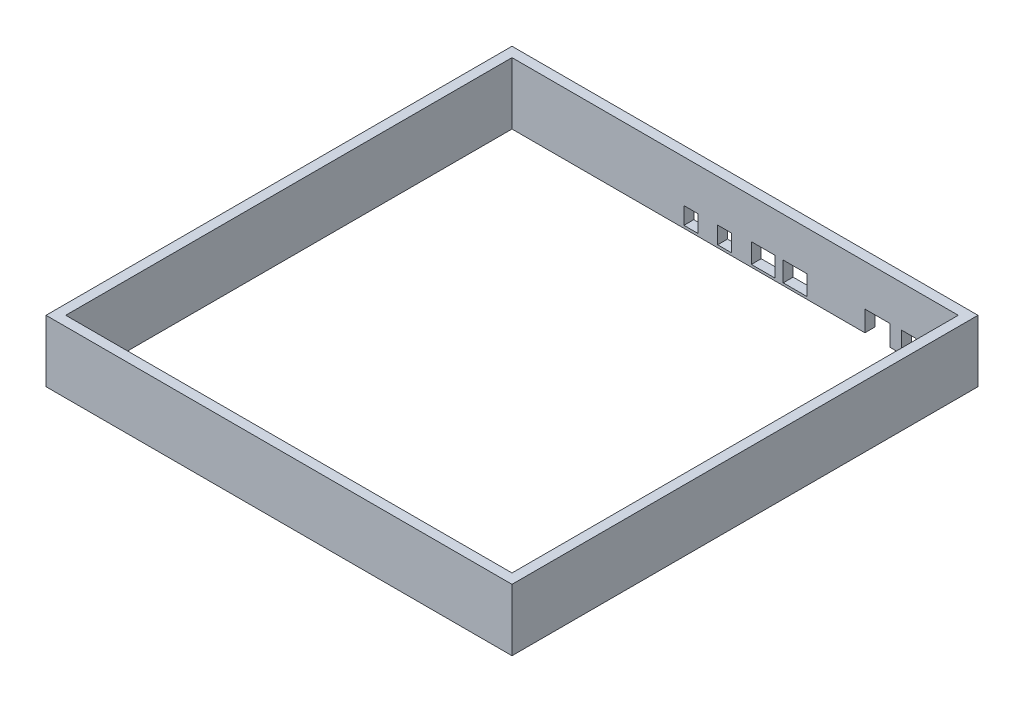
ISO-10303-21;
HEADER;
FILE_DESCRIPTION(('STEP AP214'),'2;1');
FILE_NAME('part.step','',(''),(''),'','','');
FILE_SCHEMA(('AUTOMOTIVE_DESIGN { 1 0 10303 214 1 1 1 1 }'));
ENDSEC;
DATA;
#1=APPLICATION_CONTEXT('core data for automotive mechanical design processes');
#2=APPLICATION_PROTOCOL_DEFINITION('international standard','automotive_design',2000,#1);
#3=PRODUCT_CONTEXT('',#1,'mechanical');
#4=PRODUCT('Part','Part','',(#3));
#5=PRODUCT_RELATED_PRODUCT_CATEGORY('part','',(#4));
#6=PRODUCT_DEFINITION_FORMATION('','',#4);
#7=PRODUCT_DEFINITION_CONTEXT('part definition',#1,'design');
#8=PRODUCT_DEFINITION('design','',#6,#7);
#9=PRODUCT_DEFINITION_SHAPE('','',#8);
#10=(LENGTH_UNIT() NAMED_UNIT(*) SI_UNIT(.MILLI.,.METRE.));
#11=(NAMED_UNIT(*) PLANE_ANGLE_UNIT() SI_UNIT($,.RADIAN.));
#12=(NAMED_UNIT(*) SI_UNIT($,.STERADIAN.) SOLID_ANGLE_UNIT());
#13=UNCERTAINTY_MEASURE_WITH_UNIT(LENGTH_MEASURE(1.E-05),#10,'distance_accuracy_value','');
#14=(GEOMETRIC_REPRESENTATION_CONTEXT(3) GLOBAL_UNCERTAINTY_ASSIGNED_CONTEXT((#13)) GLOBAL_UNIT_ASSIGNED_CONTEXT((#10,
#11,#12)) REPRESENTATION_CONTEXT('',''));
#15=CARTESIAN_POINT('',(0.,0.,0.));
#16=DIRECTION('',(0.,0.,1.));
#17=DIRECTION('',(1.,0.,0.));
#18=AXIS2_PLACEMENT_3D('',#15,#16,#17);
#19=CARTESIAN_POINT('',(0.,0.,0.));
#20=DIRECTION('',(0.,-1.,0.));
#21=DIRECTION('',(0.,0.,-1.));
#22=AXIS2_PLACEMENT_3D('',#19,#20,#21);
#23=PLANE('',#22);
#24=DIRECTION('',(-1.,0.,0.));
#25=VECTOR('',#24,1.);
#26=CARTESIAN_POINT('',(-150.,0.,-150.));
#27=LINE('',#26,#25);
#28=CARTESIAN_POINT('',(83.5466241257266,0.,-150.));
#29=VERTEX_POINT('',#28);
#30=CARTESIAN_POINT('',(-150.,0.,-150.));
#31=VERTEX_POINT('',#30);
#32=EDGE_CURVE('E564',#29,#31,#27,.T.);
#33=ORIENTED_EDGE('',*,*,#32,.F.);
#34=DIRECTION('',(0.,0.,-1.));
#35=VECTOR('',#34,1.);
#36=CARTESIAN_POINT('',(83.5466241257266,0.,150.001));
#37=LINE('',#36,#35);
#38=CARTESIAN_POINT('',(83.5466241257266,0.,-143.65));
#39=VERTEX_POINT('',#38);
#40=EDGE_CURVE('E302',#39,#29,#37,.T.);
#41=ORIENTED_EDGE('',*,*,#40,.F.);
#42=DIRECTION('',(-1.,0.,0.));
#43=VECTOR('',#42,1.);
#44=CARTESIAN_POINT('',(-143.65,0.,-143.65));
#45=LINE('',#44,#43);
#46=CARTESIAN_POINT('',(-143.65,0.,-143.65));
#47=VERTEX_POINT('',#46);
#48=EDGE_CURVE('E526',#39,#47,#45,.T.);
#49=ORIENTED_EDGE('',*,*,#48,.T.);
#50=DIRECTION('',(0.,0.,1.));
#51=VECTOR('',#50,1.);
#52=CARTESIAN_POINT('',(-143.65,0.,143.65));
#53=LINE('',#52,#51);
#54=CARTESIAN_POINT('',(-143.65,0.,143.65));
#55=VERTEX_POINT('',#54);
#56=EDGE_CURVE('E530',#47,#55,#53,.T.);
#57=ORIENTED_EDGE('',*,*,#56,.T.);
#58=DIRECTION('',(1.,0.,0.));
#59=VECTOR('',#58,1.);
#60=CARTESIAN_POINT('',(-143.65,0.,143.65));
#61=LINE('',#60,#59);
#62=CARTESIAN_POINT('',(143.65,0.,143.65));
#63=VERTEX_POINT('',#62);
#64=EDGE_CURVE('E513',#55,#63,#61,.T.);
#65=ORIENTED_EDGE('',*,*,#64,.T.);
#66=DIRECTION('',(0.,0.,-1.));
#67=VECTOR('',#66,1.);
#68=CARTESIAN_POINT('',(143.65,0.,143.65));
#69=LINE('',#68,#67);
#70=CARTESIAN_POINT('',(143.65,0.,-143.65));
#71=VERTEX_POINT('',#70);
#72=EDGE_CURVE('E509',#63,#71,#69,.T.);
#73=ORIENTED_EDGE('',*,*,#72,.T.);
#74=CARTESIAN_POINT('',(99.5486241257266,0.,-143.65));
#75=VERTEX_POINT('',#74);
#76=EDGE_CURVE('E527',#71,#75,#45,.T.);
#77=ORIENTED_EDGE('',*,*,#76,.T.);
#78=DIRECTION('',(0.,0.,-1.));
#79=VECTOR('',#78,1.);
#80=CARTESIAN_POINT('',(99.5486241257266,0.,150.001));
#81=LINE('',#80,#79);
#82=CARTESIAN_POINT('',(99.5486241257266,0.,-150.));
#83=VERTEX_POINT('',#82);
#84=EDGE_CURVE('E412',#75,#83,#81,.T.);
#85=ORIENTED_EDGE('',*,*,#84,.T.);
#86=CARTESIAN_POINT('',(150.,0.,-150.));
#87=VERTEX_POINT('',#86);
#88=EDGE_CURVE('E565',#87,#83,#27,.T.);
#89=ORIENTED_EDGE('',*,*,#88,.F.);
#90=DIRECTION('',(0.,0.,-1.));
#91=VECTOR('',#90,1.);
#92=CARTESIAN_POINT('',(150.,0.,150.));
#93=LINE('',#92,#91);
#94=CARTESIAN_POINT('',(150.,0.,150.));
#95=VERTEX_POINT('',#94);
#96=EDGE_CURVE('E547',#95,#87,#93,.T.);
#97=ORIENTED_EDGE('',*,*,#96,.F.);
#98=DIRECTION('',(1.,0.,0.));
#99=VECTOR('',#98,1.);
#100=CARTESIAN_POINT('',(-150.,0.,150.));
#101=LINE('',#100,#99);
#102=CARTESIAN_POINT('',(-150.,0.,150.));
#103=VERTEX_POINT('',#102);
#104=EDGE_CURVE('E552',#103,#95,#101,.T.);
#105=ORIENTED_EDGE('',*,*,#104,.F.);
#106=DIRECTION('',(0.,0.,1.));
#107=VECTOR('',#106,1.);
#108=CARTESIAN_POINT('',(-150.,0.,150.));
#109=LINE('',#108,#107);
#110=EDGE_CURVE('E568',#31,#103,#109,.T.);
#111=ORIENTED_EDGE('',*,*,#110,.F.);
#112=EDGE_LOOP('',(#33,#41,#49,#57,#65,#73,#77,#85,#89,#97,#105,#111));
#113=FACE_BOUND('',#112,.T.);
#114=ADVANCED_FACE('F38',(#113),#23,.T.);
#115=CARTESIAN_POINT('',(-150.,39.8272,-150.));
#116=DIRECTION('',(0.,0.,1.));
#117=DIRECTION('',(1.,0.,0.));
#118=AXIS2_PLACEMENT_3D('',#115,#116,#117);
#119=PLANE('',#118);
#120=DIRECTION('',(0.,-1.,0.));
#121=VECTOR('',#120,1.);
#122=CARTESIAN_POINT('',(-32.9574289216493,12.6748,-150.));
#123=LINE('',#122,#121);
#124=CARTESIAN_POINT('',(-32.9574289216493,12.6748,-150.));
#125=VERTEX_POINT('',#124);
#126=CARTESIAN_POINT('',(-32.9574289216493,1.67480000000004,-150.));
#127=VERTEX_POINT('',#126);
#128=EDGE_CURVE('E450',#125,#127,#123,.T.);
#129=ORIENTED_EDGE('',*,*,#128,.T.);
#130=DIRECTION('',(-1.,0.,0.));
#131=VECTOR('',#130,1.);
#132=CARTESIAN_POINT('',(-23.9574289216493,1.67480000000004,-150.));
#133=LINE('',#132,#131);
#134=CARTESIAN_POINT('',(-23.9574289216493,1.67480000000004,-150.));
#135=VERTEX_POINT('',#134);
#136=EDGE_CURVE('E55',#135,#127,#133,.T.);
#137=ORIENTED_EDGE('',*,*,#136,.F.);
#138=DIRECTION('',(0.,-1.,0.));
#139=VECTOR('',#138,1.);
#140=CARTESIAN_POINT('',(-23.9574289216493,12.6748,-150.));
#141=LINE('',#140,#139);
#142=CARTESIAN_POINT('',(-23.9574289216493,12.6748,-150.));
#143=VERTEX_POINT('',#142);
#144=EDGE_CURVE('E435',#143,#135,#141,.T.);
#145=ORIENTED_EDGE('',*,*,#144,.F.);
#146=DIRECTION('',(-1.,0.,0.));
#147=VECTOR('',#146,1.);
#148=CARTESIAN_POINT('',(-23.9574289216493,12.6748,-150.));
#149=LINE('',#148,#147);
#150=EDGE_CURVE('E446',#143,#125,#149,.T.);
#151=ORIENTED_EDGE('',*,*,#150,.T.);
#152=EDGE_LOOP('',(#129,#137,#145,#151));
#153=FACE_BOUND('',#152,.T.);
#154=DIRECTION('',(0.,-1.,0.));
#155=VECTOR('',#154,1.);
#156=CARTESIAN_POINT('',(83.5466241257266,0.,-150.));
#157=LINE('',#156,#155);
#158=CARTESIAN_POINT('',(83.5466241257266,13.258800000001,-150.));
#159=VERTEX_POINT('',#158);
#160=EDGE_CURVE('E420',#159,#29,#157,.T.);
#161=ORIENTED_EDGE('',*,*,#160,.T.);
#162=ORIENTED_EDGE('',*,*,#32,.T.);
#163=DIRECTION('',(0.,-1.,0.));
#164=VECTOR('',#163,1.);
#165=CARTESIAN_POINT('',(-150.,39.8272,-150.));
#166=LINE('',#165,#164);
#167=CARTESIAN_POINT('',(-150.,39.8272,-150.));
#168=VERTEX_POINT('',#167);
#169=EDGE_CURVE('E46',#168,#31,#166,.T.);
#170=ORIENTED_EDGE('',*,*,#169,.F.);
#171=DIRECTION('',(-1.,0.,0.));
#172=VECTOR('',#171,1.);
#173=CARTESIAN_POINT('',(-150.,39.8272,-150.));
#174=LINE('',#173,#172);
#175=CARTESIAN_POINT('',(150.,39.8272,-150.));
#176=VERTEX_POINT('',#175);
#177=EDGE_CURVE('E551',#176,#168,#174,.T.);
#178=ORIENTED_EDGE('',*,*,#177,.F.);
#179=DIRECTION('',(0.,-1.,0.));
#180=VECTOR('',#179,1.);
#181=CARTESIAN_POINT('',(150.,39.8272,-150.));
#182=LINE('',#181,#180);
#183=EDGE_CURVE('E11',#176,#87,#182,.T.);
#184=ORIENTED_EDGE('',*,*,#183,.T.);
#185=ORIENTED_EDGE('',*,*,#88,.T.);
#186=DIRECTION('',(0.,-1.,0.));
#187=VECTOR('',#186,1.);
#188=CARTESIAN_POINT('',(99.5486241257266,0.,-150.));
#189=LINE('',#188,#187);
#190=CARTESIAN_POINT('',(99.5486241257266,13.258800000001,-150.));
#191=VERTEX_POINT('',#190);
#192=EDGE_CURVE('E409',#191,#83,#189,.T.);
#193=ORIENTED_EDGE('',*,*,#192,.F.);
#194=DIRECTION('',(-1.,0.,0.));
#195=VECTOR('',#194,1.);
#196=CARTESIAN_POINT('',(0.,13.258800000001,-150.));
#197=LINE('',#196,#195);
#198=EDGE_CURVE('E417',#191,#159,#197,.T.);
#199=ORIENTED_EDGE('',*,*,#198,.T.);
#200=EDGE_LOOP('',(#161,#162,#170,#178,#184,#185,#193,#199));
#201=FACE_BOUND('',#200,.T.);
#202=DIRECTION('',(0.,1.,0.));
#203=VECTOR('',#202,1.);
#204=CARTESIAN_POINT('',(107.152019667205,0.,-150.));
#205=LINE('',#204,#203);
#206=CARTESIAN_POINT('',(107.152019667205,2.24078925769597,-150.));
#207=VERTEX_POINT('',#206);
#208=CARTESIAN_POINT('',(107.152019667205,13.305953258215,-150.));
#209=VERTEX_POINT('',#208);
#210=EDGE_CURVE('E308',#207,#209,#205,.T.);
#211=ORIENTED_EDGE('',*,*,#210,.F.);
#212=DIRECTION('',(-1.,0.,0.));
#213=VECTOR('',#212,1.);
#214=CARTESIAN_POINT('',(0.,2.24078925769597,-150.));
#215=LINE('',#214,#213);
#216=CARTESIAN_POINT('',(116.566624125727,2.24078925769597,-150.));
#217=VERTEX_POINT('',#216);
#218=EDGE_CURVE('E292',#217,#207,#215,.T.);
#219=ORIENTED_EDGE('',*,*,#218,.F.);
#220=DIRECTION('',(0.,1.,0.));
#221=VECTOR('',#220,1.);
#222=CARTESIAN_POINT('',(116.566624125727,0.,-150.));
#223=LINE('',#222,#221);
#224=CARTESIAN_POINT('',(116.566624125727,13.305953258215,-150.));
#225=VERTEX_POINT('',#224);
#226=EDGE_CURVE('E313',#217,#225,#223,.T.);
#227=ORIENTED_EDGE('',*,*,#226,.T.);
#228=DIRECTION('',(-1.,0.,0.));
#229=VECTOR('',#228,1.);
#230=CARTESIAN_POINT('',(0.,13.305953258215,-150.));
#231=LINE('',#230,#229);
#232=EDGE_CURVE('E285',#225,#209,#231,.T.);
#233=ORIENTED_EDGE('',*,*,#232,.T.);
#234=EDGE_LOOP('',(#211,#219,#227,#233));
#235=FACE_BOUND('',#234,.T.);
#236=DIRECTION('',(0.,-1.,0.));
#237=VECTOR('',#236,1.);
#238=CARTESIAN_POINT('',(10.4425710783508,0.,-150.));
#239=LINE('',#238,#237);
#240=CARTESIAN_POINT('',(10.4425710783508,14.2748,-150.));
#241=VERTEX_POINT('',#240);
#242=CARTESIAN_POINT('',(10.4425710783508,1.5748,-150.));
#243=VERTEX_POINT('',#242);
#244=EDGE_CURVE('E477',#241,#243,#239,.T.);
#245=ORIENTED_EDGE('',*,*,#244,.T.);
#246=DIRECTION('',(-1.,0.,0.));
#247=VECTOR('',#246,1.);
#248=CARTESIAN_POINT('',(0.,1.5748,-150.));
#249=LINE('',#248,#247);
#250=CARTESIAN_POINT('',(25.7425710783508,1.5748,-150.));
#251=VERTEX_POINT('',#250);
#252=EDGE_CURVE('E489',#251,#243,#249,.T.);
#253=ORIENTED_EDGE('',*,*,#252,.F.);
#254=DIRECTION('',(0.,-1.,0.));
#255=VECTOR('',#254,1.);
#256=CARTESIAN_POINT('',(25.7425710783508,0.,-150.));
#257=LINE('',#256,#255);
#258=CARTESIAN_POINT('',(25.7425710783508,14.2748,-150.));
#259=VERTEX_POINT('',#258);
#260=EDGE_CURVE('E485',#259,#251,#257,.T.);
#261=ORIENTED_EDGE('',*,*,#260,.F.);
#262=DIRECTION('',(-1.,0.,0.));
#263=VECTOR('',#262,1.);
#264=CARTESIAN_POINT('',(0.,14.2748,-150.));
#265=LINE('',#264,#263);
#266=EDGE_CURVE('E481',#259,#241,#265,.T.);
#267=ORIENTED_EDGE('',*,*,#266,.T.);
#268=EDGE_LOOP('',(#245,#253,#261,#267));
#269=FACE_BOUND('',#268,.T.);
#270=DIRECTION('',(-1.,0.,0.));
#271=VECTOR('',#270,1.);
#272=CARTESIAN_POINT('',(-2.25742892164925,12.6748,-150.));
#273=LINE('',#272,#271);
#274=CARTESIAN_POINT('',(-2.25742892164926,12.6748,-150.));
#275=VERTEX_POINT('',#274);
#276=CARTESIAN_POINT('',(-11.2574289216493,12.6748,-150.));
#277=VERTEX_POINT('',#276);
#278=EDGE_CURVE('E346',#275,#277,#273,.T.);
#279=ORIENTED_EDGE('',*,*,#278,.T.);
#280=DIRECTION('',(0.,1.,0.));
#281=VECTOR('',#280,1.);
#282=CARTESIAN_POINT('',(-11.2574289216493,1.67480000000004,-150.));
#283=LINE('',#282,#281);
#284=CARTESIAN_POINT('',(-11.2574289216493,1.67480000000004,-150.));
#285=VERTEX_POINT('',#284);
#286=EDGE_CURVE('E342',#285,#277,#283,.T.);
#287=ORIENTED_EDGE('',*,*,#286,.F.);
#288=DIRECTION('',(-1.,0.,0.));
#289=VECTOR('',#288,1.);
#290=CARTESIAN_POINT('',(-2.25742892164925,1.67480000000004,-150.));
#291=LINE('',#290,#289);
#292=CARTESIAN_POINT('',(-2.25742892164925,1.67480000000004,-150.));
#293=VERTEX_POINT('',#292);
#294=EDGE_CURVE('E338',#293,#285,#291,.T.);
#295=ORIENTED_EDGE('',*,*,#294,.F.);
#296=DIRECTION('',(0.,1.,0.));
#297=VECTOR('',#296,1.);
#298=CARTESIAN_POINT('',(-2.25742892164925,1.67480000000004,-150.));
#299=LINE('',#298,#297);
#300=EDGE_CURVE('E334',#293,#275,#299,.T.);
#301=ORIENTED_EDGE('',*,*,#300,.T.);
#302=EDGE_LOOP('',(#279,#287,#295,#301));
#303=FACE_BOUND('',#302,.T.);
#304=DIRECTION('',(0.,-1.,0.));
#305=VECTOR('',#304,1.);
#306=CARTESIAN_POINT('',(30.9684484780568,0.,-150.));
#307=LINE('',#306,#305);
#308=CARTESIAN_POINT('',(30.9684484780568,14.2748,-150.));
#309=VERTEX_POINT('',#308);
#310=CARTESIAN_POINT('',(30.9684484780568,1.5748,-150.));
#311=VERTEX_POINT('',#310);
#312=EDGE_CURVE('E66',#309,#311,#307,.T.);
#313=ORIENTED_EDGE('',*,*,#312,.T.);
#314=DIRECTION('',(-1.,0.,0.));
#315=VECTOR('',#314,1.);
#316=CARTESIAN_POINT('',(0.,1.5748,-150.));
#317=LINE('',#316,#315);
#318=CARTESIAN_POINT('',(46.2684484780568,1.5748,-150.));
#319=VERTEX_POINT('',#318);
#320=EDGE_CURVE('E372',#319,#311,#317,.T.);
#321=ORIENTED_EDGE('',*,*,#320,.F.);
#322=DIRECTION('',(0.,-1.,0.));
#323=VECTOR('',#322,1.);
#324=CARTESIAN_POINT('',(46.2684484780568,0.,-150.));
#325=LINE('',#324,#323);
#326=CARTESIAN_POINT('',(46.2684484780568,14.2748,-150.));
#327=VERTEX_POINT('',#326);
#328=EDGE_CURVE('E384',#327,#319,#325,.T.);
#329=ORIENTED_EDGE('',*,*,#328,.F.);
#330=DIRECTION('',(-1.,0.,0.));
#331=VECTOR('',#330,1.);
#332=CARTESIAN_POINT('',(0.,14.2748,-150.));
#333=LINE('',#332,#331);
#334=EDGE_CURVE('E388',#327,#309,#333,.T.);
#335=ORIENTED_EDGE('',*,*,#334,.T.);
#336=EDGE_LOOP('',(#313,#321,#329,#335));
#337=FACE_BOUND('',#336,.T.);
#338=ADVANCED_FACE('F600',(#153,#201,#235,#269,#303,#337),#119,.F.);
#339=CARTESIAN_POINT('',(-143.65,39.8272,-143.65));
#340=DIRECTION('',(0.,0.,1.));
#341=DIRECTION('',(1.,0.,0.));
#342=AXIS2_PLACEMENT_3D('',#339,#340,#341);
#343=PLANE('',#342);
#344=DIRECTION('',(-1.,0.,0.));
#345=VECTOR('',#344,1.);
#346=CARTESIAN_POINT('',(-23.9574289216493,1.67480000000004,-143.65));
#347=LINE('',#346,#345);
#348=CARTESIAN_POINT('',(-23.9574289216493,1.67480000000004,-143.65));
#349=VERTEX_POINT('',#348);
#350=CARTESIAN_POINT('',(-32.9574289216493,1.67480000000004,-143.65));
#351=VERTEX_POINT('',#350);
#352=EDGE_CURVE('E456',#349,#351,#347,.T.);
#353=ORIENTED_EDGE('',*,*,#352,.T.);
#354=DIRECTION('',(0.,-1.,0.));
#355=VECTOR('',#354,1.);
#356=CARTESIAN_POINT('',(-32.9574289216493,12.6748,-143.65));
#357=LINE('',#356,#355);
#358=CARTESIAN_POINT('',(-32.9574289216493,12.6748,-143.65));
#359=VERTEX_POINT('',#358);
#360=EDGE_CURVE('E427',#359,#351,#357,.T.);
#361=ORIENTED_EDGE('',*,*,#360,.F.);
#362=DIRECTION('',(-1.,0.,0.));
#363=VECTOR('',#362,1.);
#364=CARTESIAN_POINT('',(-23.9574289216493,12.6748,-143.65));
#365=LINE('',#364,#363);
#366=CARTESIAN_POINT('',(-23.9574289216493,12.6748,-143.65));
#367=VERTEX_POINT('',#366);
#368=EDGE_CURVE('E321',#367,#359,#365,.T.);
#369=ORIENTED_EDGE('',*,*,#368,.F.);
#370=DIRECTION('',(0.,-1.,0.));
#371=VECTOR('',#370,1.);
#372=CARTESIAN_POINT('',(-23.9574289216493,12.6748,-143.65));
#373=LINE('',#372,#371);
#374=EDGE_CURVE('E460',#367,#349,#373,.T.);
#375=ORIENTED_EDGE('',*,*,#374,.T.);
#376=EDGE_LOOP('',(#353,#361,#369,#375));
#377=FACE_BOUND('',#376,.T.);
#378=DIRECTION('',(-1.,0.,0.));
#379=VECTOR('',#378,1.);
#380=CARTESIAN_POINT('',(0.,2.24078925769597,-143.65));
#381=LINE('',#380,#379);
#382=CARTESIAN_POINT('',(116.566624125727,2.24078925769597,-143.65));
#383=VERTEX_POINT('',#382);
#384=CARTESIAN_POINT('',(107.152019667205,2.24078925769597,-143.65));
#385=VERTEX_POINT('',#384);
#386=EDGE_CURVE('E289',#383,#385,#381,.T.);
#387=ORIENTED_EDGE('',*,*,#386,.T.);
#388=DIRECTION('',(0.,1.,0.));
#389=VECTOR('',#388,1.);
#390=CARTESIAN_POINT('',(107.152019667205,0.,-143.65));
#391=LINE('',#390,#389);
#392=CARTESIAN_POINT('',(107.152019667205,13.305953258215,-143.65));
#393=VERTEX_POINT('',#392);
#394=EDGE_CURVE('E274',#385,#393,#391,.T.);
#395=ORIENTED_EDGE('',*,*,#394,.T.);
#396=DIRECTION('',(-1.,0.,0.));
#397=VECTOR('',#396,1.);
#398=CARTESIAN_POINT('',(0.,13.305953258215,-143.65));
#399=LINE('',#398,#397);
#400=CARTESIAN_POINT('',(116.566624125727,13.305953258215,-143.65));
#401=VERTEX_POINT('',#400);
#402=EDGE_CURVE('E362',#401,#393,#399,.T.);
#403=ORIENTED_EDGE('',*,*,#402,.F.);
#404=DIRECTION('',(0.,1.,0.));
#405=VECTOR('',#404,1.);
#406=CARTESIAN_POINT('',(116.566624125727,0.,-143.65));
#407=LINE('',#406,#405);
#408=EDGE_CURVE('E298',#383,#401,#407,.T.);
#409=ORIENTED_EDGE('',*,*,#408,.F.);
#410=EDGE_LOOP('',(#387,#395,#403,#409));
#411=FACE_BOUND('',#410,.T.);
#412=DIRECTION('',(-1.,0.,0.));
#413=VECTOR('',#412,1.);
#414=CARTESIAN_POINT('',(0.,1.5748,-143.65));
#415=LINE('',#414,#413);
#416=CARTESIAN_POINT('',(25.7425710783508,1.5748,-143.65));
#417=VERTEX_POINT('',#416);
#418=CARTESIAN_POINT('',(10.4425710783508,1.5748,-143.65));
#419=VERTEX_POINT('',#418);
#420=EDGE_CURVE('E469',#417,#419,#415,.T.);
#421=ORIENTED_EDGE('',*,*,#420,.T.);
#422=DIRECTION('',(0.,-1.,0.));
#423=VECTOR('',#422,1.);
#424=CARTESIAN_POINT('',(10.4425710783508,0.,-143.65));
#425=LINE('',#424,#423);
#426=CARTESIAN_POINT('',(10.4425710783508,14.2748,-143.65));
#427=VERTEX_POINT('',#426);
#428=EDGE_CURVE('E473',#427,#419,#425,.T.);
#429=ORIENTED_EDGE('',*,*,#428,.F.);
#430=DIRECTION('',(-1.,0.,0.));
#431=VECTOR('',#430,1.);
#432=CARTESIAN_POINT('',(0.,14.2748,-143.65));
#433=LINE('',#432,#431);
#434=CARTESIAN_POINT('',(25.7425710783508,14.2748,-143.65));
#435=VERTEX_POINT('',#434);
#436=EDGE_CURVE('E497',#435,#427,#433,.T.);
#437=ORIENTED_EDGE('',*,*,#436,.F.);
#438=DIRECTION('',(0.,-1.,0.));
#439=VECTOR('',#438,1.);
#440=CARTESIAN_POINT('',(25.7425710783508,0.,-143.65));
#441=LINE('',#440,#439);
#442=EDGE_CURVE('E405',#435,#417,#441,.T.);
#443=ORIENTED_EDGE('',*,*,#442,.T.);
#444=EDGE_LOOP('',(#421,#429,#437,#443));
#445=FACE_BOUND('',#444,.T.);
#446=DIRECTION('',(0.,1.,0.));
#447=VECTOR('',#446,1.);
#448=CARTESIAN_POINT('',(-11.2574289216493,1.67480000000004,-143.65));
#449=LINE('',#448,#447);
#450=CARTESIAN_POINT('',(-11.2574289216493,1.67480000000004,-143.65));
#451=VERTEX_POINT('',#450);
#452=CARTESIAN_POINT('',(-11.2574289216493,12.6748,-143.65));
#453=VERTEX_POINT('',#452);
#454=EDGE_CURVE('E354',#451,#453,#449,.T.);
#455=ORIENTED_EDGE('',*,*,#454,.T.);
#456=DIRECTION('',(-1.,0.,0.));
#457=VECTOR('',#456,1.);
#458=CARTESIAN_POINT('',(-2.25742892164925,12.6748,-143.65));
#459=LINE('',#458,#457);
#460=CARTESIAN_POINT('',(-2.25742892164925,12.6748,-143.65));
#461=VERTEX_POINT('',#460);
#462=EDGE_CURVE('E350',#461,#453,#459,.T.);
#463=ORIENTED_EDGE('',*,*,#462,.F.);
#464=DIRECTION('',(0.,1.,0.));
#465=VECTOR('',#464,1.);
#466=CARTESIAN_POINT('',(-2.25742892164925,1.67480000000004,-143.65));
#467=LINE('',#466,#465);
#468=CARTESIAN_POINT('',(-2.25742892164926,1.67480000000004,-143.65));
#469=VERTEX_POINT('',#468);
#470=EDGE_CURVE('E316',#469,#461,#467,.T.);
#471=ORIENTED_EDGE('',*,*,#470,.F.);
#472=DIRECTION('',(-1.,0.,0.));
#473=VECTOR('',#472,1.);
#474=CARTESIAN_POINT('',(-2.25742892164925,1.67480000000004,-143.65));
#475=LINE('',#474,#473);
#476=EDGE_CURVE('E358',#469,#451,#475,.T.);
#477=ORIENTED_EDGE('',*,*,#476,.T.);
#478=EDGE_LOOP('',(#455,#463,#471,#477));
#479=FACE_BOUND('',#478,.T.);
#480=ORIENTED_EDGE('',*,*,#48,.F.);
#481=DIRECTION('',(0.,-1.,0.));
#482=VECTOR('',#481,1.);
#483=CARTESIAN_POINT('',(83.5466241257266,0.,-143.65));
#484=LINE('',#483,#482);
#485=CARTESIAN_POINT('',(83.5466241257266,13.258800000001,-143.65));
#486=VERTEX_POINT('',#485);
#487=EDGE_CURVE('E423',#486,#39,#484,.T.);
#488=ORIENTED_EDGE('',*,*,#487,.F.);
#489=DIRECTION('',(-1.,0.,0.));
#490=VECTOR('',#489,1.);
#491=CARTESIAN_POINT('',(0.,13.258800000001,-143.65));
#492=LINE('',#491,#490);
#493=CARTESIAN_POINT('',(99.5486241257266,13.258800000001,-143.65));
#494=VERTEX_POINT('',#493);
#495=EDGE_CURVE('E299',#494,#486,#492,.T.);
#496=ORIENTED_EDGE('',*,*,#495,.F.);
#497=DIRECTION('',(0.,-1.,0.));
#498=VECTOR('',#497,1.);
#499=CARTESIAN_POINT('',(99.5486241257266,0.,-143.65));
#500=LINE('',#499,#498);
#501=EDGE_CURVE('E368',#494,#75,#500,.T.);
#502=ORIENTED_EDGE('',*,*,#501,.T.);
#503=ORIENTED_EDGE('',*,*,#76,.F.);
#504=DIRECTION('',(0.,-1.,0.));
#505=VECTOR('',#504,1.);
#506=CARTESIAN_POINT('',(143.65,39.8272,-143.65));
#507=LINE('',#506,#505);
#508=CARTESIAN_POINT('',(143.65,39.8272,-143.65));
#509=VERTEX_POINT('',#508);
#510=EDGE_CURVE('E544',#509,#71,#507,.T.);
#511=ORIENTED_EDGE('',*,*,#510,.F.);
#512=DIRECTION('',(-1.,0.,0.));
#513=VECTOR('',#512,1.);
#514=CARTESIAN_POINT('',(-143.65,39.8272,-143.65));
#515=LINE('',#514,#513);
#516=CARTESIAN_POINT('',(-143.65,39.8272,-143.65));
#517=VERTEX_POINT('',#516);
#518=EDGE_CURVE('E512',#509,#517,#515,.T.);
#519=ORIENTED_EDGE('',*,*,#518,.T.);
#520=DIRECTION('',(0.,-1.,0.));
#521=VECTOR('',#520,1.);
#522=CARTESIAN_POINT('',(-143.65,39.8272,-143.65));
#523=LINE('',#522,#521);
#524=EDGE_CURVE('E541',#517,#47,#523,.T.);
#525=ORIENTED_EDGE('',*,*,#524,.T.);
#526=EDGE_LOOP('',(#480,#488,#496,#502,#503,#511,#519,#525));
#527=FACE_BOUND('',#526,.T.);
#528=DIRECTION('',(-1.,0.,0.));
#529=VECTOR('',#528,1.);
#530=CARTESIAN_POINT('',(0.,1.5748,-143.65));
#531=LINE('',#530,#529);
#532=CARTESIAN_POINT('',(46.2684484780568,1.5748,-143.65));
#533=VERTEX_POINT('',#532);
#534=CARTESIAN_POINT('',(30.9684484780568,1.5748,-143.65));
#535=VERTEX_POINT('',#534);
#536=EDGE_CURVE('E398',#533,#535,#531,.T.);
#537=ORIENTED_EDGE('',*,*,#536,.T.);
#538=DIRECTION('',(0.,-1.,0.));
#539=VECTOR('',#538,1.);
#540=CARTESIAN_POINT('',(30.9684484780568,0.,-143.65));
#541=LINE('',#540,#539);
#542=CARTESIAN_POINT('',(30.9684484780568,14.2748,-143.65));
#543=VERTEX_POINT('',#542);
#544=EDGE_CURVE('E394',#543,#535,#541,.T.);
#545=ORIENTED_EDGE('',*,*,#544,.F.);
#546=DIRECTION('',(-1.,0.,0.));
#547=VECTOR('',#546,1.);
#548=CARTESIAN_POINT('',(0.,14.2748,-143.65));
#549=LINE('',#548,#547);
#550=CARTESIAN_POINT('',(46.2684484780568,14.2748,-143.65));
#551=VERTEX_POINT('',#550);
#552=EDGE_CURVE('E363',#551,#543,#549,.T.);
#553=ORIENTED_EDGE('',*,*,#552,.F.);
#554=DIRECTION('',(0.,-1.,0.));
#555=VECTOR('',#554,1.);
#556=CARTESIAN_POINT('',(46.2684484780568,0.,-143.65));
#557=LINE('',#556,#555);
#558=EDGE_CURVE('E402',#551,#533,#557,.T.);
#559=ORIENTED_EDGE('',*,*,#558,.T.);
#560=EDGE_LOOP('',(#537,#545,#553,#559));
#561=FACE_BOUND('',#560,.T.);
#562=ADVANCED_FACE('F296',(#377,#411,#445,#479,#527,#561),#343,.T.);
#563=CARTESIAN_POINT('',(0.,39.8272,0.));
#564=DIRECTION('',(0.,-1.,0.));
#565=DIRECTION('',(0.,0.,-1.));
#566=AXIS2_PLACEMENT_3D('',#563,#564,#565);
#567=PLANE('',#566);
#568=DIRECTION('',(0.,0.,-1.));
#569=VECTOR('',#568,1.);
#570=CARTESIAN_POINT('',(150.,39.8272,150.));
#571=LINE('',#570,#569);
#572=CARTESIAN_POINT('',(150.,39.8272,150.));
#573=VERTEX_POINT('',#572);
#574=EDGE_CURVE('E548',#573,#176,#571,.T.);
#575=ORIENTED_EDGE('',*,*,#574,.T.);
#576=ORIENTED_EDGE('',*,*,#177,.T.);
#577=DIRECTION('',(0.,0.,1.));
#578=VECTOR('',#577,1.);
#579=CARTESIAN_POINT('',(-150.,39.8272,150.));
#580=LINE('',#579,#578);
#581=CARTESIAN_POINT('',(-150.,39.8272,150.));
#582=VERTEX_POINT('',#581);
#583=EDGE_CURVE('E555',#168,#582,#580,.T.);
#584=ORIENTED_EDGE('',*,*,#583,.T.);
#585=DIRECTION('',(1.,0.,0.));
#586=VECTOR('',#585,1.);
#587=CARTESIAN_POINT('',(-150.,39.8272,150.));
#588=LINE('',#587,#586);
#589=EDGE_CURVE('E558',#582,#573,#588,.T.);
#590=ORIENTED_EDGE('',*,*,#589,.T.);
#591=EDGE_LOOP('',(#575,#576,#584,#590));
#592=FACE_BOUND('',#591,.T.);
#593=DIRECTION('',(0.,0.,-1.));
#594=VECTOR('',#593,1.);
#595=CARTESIAN_POINT('',(143.65,39.8272,143.65));
#596=LINE('',#595,#594);
#597=CARTESIAN_POINT('',(143.65,39.8272,143.65));
#598=VERTEX_POINT('',#597);
#599=EDGE_CURVE('E510',#598,#509,#596,.T.);
#600=ORIENTED_EDGE('',*,*,#599,.F.);
#601=DIRECTION('',(1.,0.,0.));
#602=VECTOR('',#601,1.);
#603=CARTESIAN_POINT('',(-143.65,39.8272,143.65));
#604=LINE('',#603,#602);
#605=CARTESIAN_POINT('',(-143.65,39.8272,143.65));
#606=VERTEX_POINT('',#605);
#607=EDGE_CURVE('E520',#606,#598,#604,.T.);
#608=ORIENTED_EDGE('',*,*,#607,.F.);
#609=DIRECTION('',(0.,0.,1.));
#610=VECTOR('',#609,1.);
#611=CARTESIAN_POINT('',(-143.65,39.8272,143.65));
#612=LINE('',#611,#610);
#613=EDGE_CURVE('E516',#517,#606,#612,.T.);
#614=ORIENTED_EDGE('',*,*,#613,.F.);
#615=ORIENTED_EDGE('',*,*,#518,.F.);
#616=EDGE_LOOP('',(#600,#608,#614,#615));
#617=FACE_BOUND('',#616,.T.);
#618=ADVANCED_FACE('F598',(#592,#617),#567,.F.);
#619=CARTESIAN_POINT('',(150.,39.8272,150.));
#620=DIRECTION('',(-1.,0.,0.));
#621=DIRECTION('',(0.,0.,1.));
#622=AXIS2_PLACEMENT_3D('',#619,#620,#621);
#623=PLANE('',#622);
#624=ORIENTED_EDGE('',*,*,#96,.T.);
#625=ORIENTED_EDGE('',*,*,#183,.F.);
#626=ORIENTED_EDGE('',*,*,#574,.F.);
#627=DIRECTION('',(0.,-1.,0.));
#628=VECTOR('',#627,1.);
#629=CARTESIAN_POINT('',(150.,39.8272,150.));
#630=LINE('',#629,#628);
#631=EDGE_CURVE('E560',#573,#95,#630,.T.);
#632=ORIENTED_EDGE('',*,*,#631,.T.);
#633=EDGE_LOOP('',(#624,#625,#626,#632));
#634=FACE_BOUND('',#633,.T.);
#635=ADVANCED_FACE('F40',(#634),#623,.F.);
#636=CARTESIAN_POINT('',(-150.,39.8272,150.));
#637=DIRECTION('',(1.,0.,0.));
#638=DIRECTION('',(0.,0.,-1.));
#639=AXIS2_PLACEMENT_3D('',#636,#637,#638);
#640=PLANE('',#639);
#641=ORIENTED_EDGE('',*,*,#110,.T.);
#642=DIRECTION('',(0.,-1.,0.));
#643=VECTOR('',#642,1.);
#644=CARTESIAN_POINT('',(-150.,39.8272,150.));
#645=LINE('',#644,#643);
#646=EDGE_CURVE('E575',#582,#103,#645,.T.);
#647=ORIENTED_EDGE('',*,*,#646,.F.);
#648=ORIENTED_EDGE('',*,*,#583,.F.);
#649=ORIENTED_EDGE('',*,*,#169,.T.);
#650=EDGE_LOOP('',(#641,#647,#648,#649));
#651=FACE_BOUND('',#650,.T.);
#652=ADVANCED_FACE('F582',(#651),#640,.F.);
#653=CARTESIAN_POINT('',(-150.,39.8272,150.));
#654=DIRECTION('',(0.,0.,-1.));
#655=DIRECTION('',(-1.,0.,0.));
#656=AXIS2_PLACEMENT_3D('',#653,#654,#655);
#657=PLANE('',#656);
#658=ORIENTED_EDGE('',*,*,#104,.T.);
#659=ORIENTED_EDGE('',*,*,#631,.F.);
#660=ORIENTED_EDGE('',*,*,#589,.F.);
#661=ORIENTED_EDGE('',*,*,#646,.T.);
#662=EDGE_LOOP('',(#658,#659,#660,#661));
#663=FACE_BOUND('',#662,.T.);
#664=ADVANCED_FACE('F592',(#663),#657,.F.);
#665=CARTESIAN_POINT('',(143.65,39.8272,143.65));
#666=DIRECTION('',(-1.,0.,0.));
#667=DIRECTION('',(0.,0.,1.));
#668=AXIS2_PLACEMENT_3D('',#665,#666,#667);
#669=PLANE('',#668);
#670=ORIENTED_EDGE('',*,*,#72,.F.);
#671=DIRECTION('',(0.,-1.,0.));
#672=VECTOR('',#671,1.);
#673=CARTESIAN_POINT('',(143.65,39.8272,143.65));
#674=LINE('',#673,#672);
#675=EDGE_CURVE('E522',#598,#63,#674,.T.);
#676=ORIENTED_EDGE('',*,*,#675,.F.);
#677=ORIENTED_EDGE('',*,*,#599,.T.);
#678=ORIENTED_EDGE('',*,*,#510,.T.);
#679=EDGE_LOOP('',(#670,#676,#677,#678));
#680=FACE_BOUND('',#679,.T.);
#681=ADVANCED_FACE('F633',(#680),#669,.T.);
#682=CARTESIAN_POINT('',(-143.65,39.8272,143.65));
#683=DIRECTION('',(1.,0.,0.));
#684=DIRECTION('',(0.,0.,-1.));
#685=AXIS2_PLACEMENT_3D('',#682,#683,#684);
#686=PLANE('',#685);
#687=ORIENTED_EDGE('',*,*,#56,.F.);
#688=ORIENTED_EDGE('',*,*,#524,.F.);
#689=ORIENTED_EDGE('',*,*,#613,.T.);
#690=DIRECTION('',(0.,-1.,0.));
#691=VECTOR('',#690,1.);
#692=CARTESIAN_POINT('',(-143.65,39.8272,143.65));
#693=LINE('',#692,#691);
#694=EDGE_CURVE('E539',#606,#55,#693,.T.);
#695=ORIENTED_EDGE('',*,*,#694,.T.);
#696=EDGE_LOOP('',(#687,#688,#689,#695));
#697=FACE_BOUND('',#696,.T.);
#698=ADVANCED_FACE('F625',(#697),#686,.T.);
#699=CARTESIAN_POINT('',(-143.65,39.8272,143.65));
#700=DIRECTION('',(0.,0.,-1.));
#701=DIRECTION('',(-1.,0.,0.));
#702=AXIS2_PLACEMENT_3D('',#699,#700,#701);
#703=PLANE('',#702);
#704=ORIENTED_EDGE('',*,*,#64,.F.);
#705=ORIENTED_EDGE('',*,*,#694,.F.);
#706=ORIENTED_EDGE('',*,*,#607,.T.);
#707=ORIENTED_EDGE('',*,*,#675,.T.);
#708=EDGE_LOOP('',(#704,#705,#706,#707));
#709=FACE_BOUND('',#708,.T.);
#710=ADVANCED_FACE('F628',(#709),#703,.T.);
#711=CARTESIAN_POINT('',(10.4425710783508,0.,150.001));
#712=DIRECTION('',(1.,0.,0.));
#713=DIRECTION('',(0.,0.,-1.));
#714=AXIS2_PLACEMENT_3D('',#711,#712,#713);
#715=PLANE('',#714);
#716=ORIENTED_EDGE('',*,*,#428,.T.);
#717=DIRECTION('',(0.,0.,-1.));
#718=VECTOR('',#717,1.);
#719=CARTESIAN_POINT('',(10.4425710783508,1.5748,150.001));
#720=LINE('',#719,#718);
#721=EDGE_CURVE('E494',#419,#243,#720,.T.);
#722=ORIENTED_EDGE('',*,*,#721,.T.);
#723=ORIENTED_EDGE('',*,*,#244,.F.);
#724=DIRECTION('',(0.,0.,-1.));
#725=VECTOR('',#724,1.);
#726=CARTESIAN_POINT('',(10.4425710783508,14.2748,150.001));
#727=LINE('',#726,#725);
#728=EDGE_CURVE('E493',#427,#241,#727,.T.);
#729=ORIENTED_EDGE('',*,*,#728,.F.);
#730=EDGE_LOOP('',(#716,#722,#723,#729));
#731=FACE_BOUND('',#730,.T.);
#732=ADVANCED_FACE('F677',(#731),#715,.T.);
#733=CARTESIAN_POINT('',(0.,1.5748,150.001));
#734=DIRECTION('',(0.,-1.,0.));
#735=DIRECTION('',(0.,0.,-1.));
#736=AXIS2_PLACEMENT_3D('',#733,#734,#735);
#737=PLANE('',#736);
#738=DIRECTION('',(0.,0.,-1.));
#739=VECTOR('',#738,1.);
#740=CARTESIAN_POINT('',(25.7425710783508,1.5748,150.001));
#741=LINE('',#740,#739);
#742=EDGE_CURVE('E498',#417,#251,#741,.T.);
#743=ORIENTED_EDGE('',*,*,#742,.T.);
#744=ORIENTED_EDGE('',*,*,#252,.T.);
#745=ORIENTED_EDGE('',*,*,#721,.F.);
#746=ORIENTED_EDGE('',*,*,#420,.F.);
#747=EDGE_LOOP('',(#743,#744,#745,#746));
#748=FACE_BOUND('',#747,.T.);
#749=ADVANCED_FACE('F683',(#748),#737,.F.);
#750=CARTESIAN_POINT('',(25.7425710783508,0.,150.001));
#751=DIRECTION('',(1.,0.,0.));
#752=DIRECTION('',(0.,0.,-1.));
#753=AXIS2_PLACEMENT_3D('',#750,#751,#752);
#754=PLANE('',#753);
#755=DIRECTION('',(0.,0.,-1.));
#756=VECTOR('',#755,1.);
#757=CARTESIAN_POINT('',(25.7425710783508,14.2748,150.001));
#758=LINE('',#757,#756);
#759=EDGE_CURVE('E501',#435,#259,#758,.T.);
#760=ORIENTED_EDGE('',*,*,#759,.T.);
#761=ORIENTED_EDGE('',*,*,#260,.T.);
#762=ORIENTED_EDGE('',*,*,#742,.F.);
#763=ORIENTED_EDGE('',*,*,#442,.F.);
#764=EDGE_LOOP('',(#760,#761,#762,#763));
#765=FACE_BOUND('',#764,.T.);
#766=ADVANCED_FACE('F692',(#765),#754,.F.);
#767=CARTESIAN_POINT('',(0.,14.2748,150.001));
#768=DIRECTION('',(0.,-1.,0.));
#769=DIRECTION('',(0.,0.,-1.));
#770=AXIS2_PLACEMENT_3D('',#767,#768,#769);
#771=PLANE('',#770);
#772=ORIENTED_EDGE('',*,*,#436,.T.);
#773=ORIENTED_EDGE('',*,*,#728,.T.);
#774=ORIENTED_EDGE('',*,*,#266,.F.);
#775=ORIENTED_EDGE('',*,*,#759,.F.);
#776=EDGE_LOOP('',(#772,#773,#774,#775));
#777=FACE_BOUND('',#776,.T.);
#778=ADVANCED_FACE('F700',(#777),#771,.T.);
#779=CARTESIAN_POINT('',(-2.25742892164925,12.6748,150.001));
#780=DIRECTION('',(0.,-1.,0.));
#781=DIRECTION('',(0.,0.,-1.));
#782=AXIS2_PLACEMENT_3D('',#779,#780,#781);
#783=PLANE('',#782);
#784=ORIENTED_EDGE('',*,*,#462,.T.);
#785=DIRECTION('',(0.,0.,-1.));
#786=VECTOR('',#785,1.);
#787=CARTESIAN_POINT('',(-11.2574289216493,12.6748,150.001));
#788=LINE('',#787,#786);
#789=EDGE_CURVE('E320',#453,#277,#788,.T.);
#790=ORIENTED_EDGE('',*,*,#789,.T.);
#791=ORIENTED_EDGE('',*,*,#278,.F.);
#792=DIRECTION('',(0.,0.,-1.));
#793=VECTOR('',#792,1.);
#794=CARTESIAN_POINT('',(-2.25742892164925,12.6748,150.001));
#795=LINE('',#794,#793);
#796=EDGE_CURVE('E330',#461,#275,#795,.T.);
#797=ORIENTED_EDGE('',*,*,#796,.F.);
#798=EDGE_LOOP('',(#784,#790,#791,#797));
#799=FACE_BOUND('',#798,.T.);
#800=ADVANCED_FACE('F708',(#799),#783,.T.);
#801=CARTESIAN_POINT('',(-11.2574289216493,1.67480000000004,150.001));
#802=DIRECTION('',(-1.,0.,0.));
#803=DIRECTION('',(0.,0.,1.));
#804=AXIS2_PLACEMENT_3D('',#801,#802,#803);
#805=PLANE('',#804);
#806=DIRECTION('',(0.,0.,-1.));
#807=VECTOR('',#806,1.);
#808=CARTESIAN_POINT('',(-11.2574289216493,1.67480000000004,150.001));
#809=LINE('',#808,#807);
#810=EDGE_CURVE('E324',#451,#285,#809,.T.);
#811=ORIENTED_EDGE('',*,*,#810,.T.);
#812=ORIENTED_EDGE('',*,*,#286,.T.);
#813=ORIENTED_EDGE('',*,*,#789,.F.);
#814=ORIENTED_EDGE('',*,*,#454,.F.);
#815=EDGE_LOOP('',(#811,#812,#813,#814));
#816=FACE_BOUND('',#815,.T.);
#817=ADVANCED_FACE('F716',(#816),#805,.F.);
#818=CARTESIAN_POINT('',(-2.25742892164925,1.67480000000004,150.001));
#819=DIRECTION('',(0.,-1.,0.));
#820=DIRECTION('',(0.,0.,-1.));
#821=AXIS2_PLACEMENT_3D('',#818,#819,#820);
#822=PLANE('',#821);
#823=DIRECTION('',(0.,0.,-1.));
#824=VECTOR('',#823,1.);
#825=CARTESIAN_POINT('',(-2.25742892164925,1.67480000000004,150.001));
#826=LINE('',#825,#824);
#827=EDGE_CURVE('E327',#469,#293,#826,.T.);
#828=ORIENTED_EDGE('',*,*,#827,.T.);
#829=ORIENTED_EDGE('',*,*,#294,.T.);
#830=ORIENTED_EDGE('',*,*,#810,.F.);
#831=ORIENTED_EDGE('',*,*,#476,.F.);
#832=EDGE_LOOP('',(#828,#829,#830,#831));
#833=FACE_BOUND('',#832,.T.);
#834=ADVANCED_FACE('F724',(#833),#822,.F.);
#835=CARTESIAN_POINT('',(-2.25742892164925,1.67480000000004,150.001));
#836=DIRECTION('',(-1.,0.,0.));
#837=DIRECTION('',(0.,0.,1.));
#838=AXIS2_PLACEMENT_3D('',#835,#836,#837);
#839=PLANE('',#838);
#840=ORIENTED_EDGE('',*,*,#470,.T.);
#841=ORIENTED_EDGE('',*,*,#796,.T.);
#842=ORIENTED_EDGE('',*,*,#300,.F.);
#843=ORIENTED_EDGE('',*,*,#827,.F.);
#844=EDGE_LOOP('',(#840,#841,#842,#843));
#845=FACE_BOUND('',#844,.T.);
#846=ADVANCED_FACE('F732',(#845),#839,.T.);
#847=CARTESIAN_POINT('',(0.,2.24078925769597,150.001));
#848=DIRECTION('',(0.,-1.,0.));
#849=DIRECTION('',(0.,0.,-1.));
#850=AXIS2_PLACEMENT_3D('',#847,#848,#849);
#851=PLANE('',#850);
#852=DIRECTION('',(0.,0.,-1.));
#853=VECTOR('',#852,1.);
#854=CARTESIAN_POINT('',(116.566624125727,2.24078925769597,150.001));
#855=LINE('',#854,#853);
#856=EDGE_CURVE('E293',#383,#217,#855,.T.);
#857=ORIENTED_EDGE('',*,*,#856,.T.);
#858=ORIENTED_EDGE('',*,*,#218,.T.);
#859=DIRECTION('',(0.,0.,-1.));
#860=VECTOR('',#859,1.);
#861=CARTESIAN_POINT('',(107.152019667205,2.24078925769597,150.001));
#862=LINE('',#861,#860);
#863=EDGE_CURVE('E278',#385,#207,#862,.T.);
#864=ORIENTED_EDGE('',*,*,#863,.F.);
#865=ORIENTED_EDGE('',*,*,#386,.F.);
#866=EDGE_LOOP('',(#857,#858,#864,#865));
#867=FACE_BOUND('',#866,.T.);
#868=ADVANCED_FACE('F288',(#867),#851,.F.);
#869=CARTESIAN_POINT('',(116.566624125727,0.,150.001));
#870=DIRECTION('',(-1.,0.,0.));
#871=DIRECTION('',(0.,0.,1.));
#872=AXIS2_PLACEMENT_3D('',#869,#870,#871);
#873=PLANE('',#872);
#874=ORIENTED_EDGE('',*,*,#408,.T.);
#875=DIRECTION('',(0.,0.,-1.));
#876=VECTOR('',#875,1.);
#877=CARTESIAN_POINT('',(116.566624125727,13.305953258215,150.001));
#878=LINE('',#877,#876);
#879=EDGE_CURVE('E312',#401,#225,#878,.T.);
#880=ORIENTED_EDGE('',*,*,#879,.T.);
#881=ORIENTED_EDGE('',*,*,#226,.F.);
#882=ORIENTED_EDGE('',*,*,#856,.F.);
#883=EDGE_LOOP('',(#874,#880,#881,#882));
#884=FACE_BOUND('',#883,.T.);
#885=ADVANCED_FACE('F745',(#884),#873,.T.);
#886=CARTESIAN_POINT('',(0.,13.305953258215,150.001));
#887=DIRECTION('',(0.,-1.,0.));
#888=DIRECTION('',(0.,0.,-1.));
#889=AXIS2_PLACEMENT_3D('',#886,#887,#888);
#890=PLANE('',#889);
#891=ORIENTED_EDGE('',*,*,#402,.T.);
#892=DIRECTION('',(0.,0.,-1.));
#893=VECTOR('',#892,1.);
#894=CARTESIAN_POINT('',(107.152019667205,13.305953258215,150.001));
#895=LINE('',#894,#893);
#896=EDGE_CURVE('E280',#393,#209,#895,.T.);
#897=ORIENTED_EDGE('',*,*,#896,.T.);
#898=ORIENTED_EDGE('',*,*,#232,.F.);
#899=ORIENTED_EDGE('',*,*,#879,.F.);
#900=EDGE_LOOP('',(#891,#897,#898,#899));
#901=FACE_BOUND('',#900,.T.);
#902=ADVANCED_FACE('F752',(#901),#890,.T.);
#903=CARTESIAN_POINT('',(107.152019667205,0.,150.001));
#904=DIRECTION('',(-1.,0.,0.));
#905=DIRECTION('',(0.,0.,1.));
#906=AXIS2_PLACEMENT_3D('',#903,#904,#905);
#907=PLANE('',#906);
#908=ORIENTED_EDGE('',*,*,#863,.T.);
#909=ORIENTED_EDGE('',*,*,#210,.T.);
#910=ORIENTED_EDGE('',*,*,#896,.F.);
#911=ORIENTED_EDGE('',*,*,#394,.F.);
#912=EDGE_LOOP('',(#908,#909,#910,#911));
#913=FACE_BOUND('',#912,.T.);
#914=ADVANCED_FACE('F276',(#913),#907,.F.);
#915=CARTESIAN_POINT('',(83.5466241257266,0.,150.001));
#916=DIRECTION('',(1.,0.,0.));
#917=DIRECTION('',(0.,0.,-1.));
#918=AXIS2_PLACEMENT_3D('',#915,#916,#917);
#919=PLANE('',#918);
#920=ORIENTED_EDGE('',*,*,#487,.T.);
#921=ORIENTED_EDGE('',*,*,#40,.T.);
#922=ORIENTED_EDGE('',*,*,#160,.F.);
#923=DIRECTION('',(0.,0.,-1.));
#924=VECTOR('',#923,1.);
#925=CARTESIAN_POINT('',(83.5466241257266,13.258800000001,150.001));
#926=LINE('',#925,#924);
#927=EDGE_CURVE('E407',#486,#159,#926,.T.);
#928=ORIENTED_EDGE('',*,*,#927,.F.);
#929=EDGE_LOOP('',(#920,#921,#922,#928));
#930=FACE_BOUND('',#929,.T.);
#931=ADVANCED_FACE('F617',(#930),#919,.T.);
#932=CARTESIAN_POINT('',(99.5486241257266,0.,150.001));
#933=DIRECTION('',(1.,0.,0.));
#934=DIRECTION('',(0.,0.,-1.));
#935=AXIS2_PLACEMENT_3D('',#932,#933,#934);
#936=PLANE('',#935);
#937=DIRECTION('',(0.,0.,-1.));
#938=VECTOR('',#937,1.);
#939=CARTESIAN_POINT('',(99.5486241257266,13.258800000001,150.001));
#940=LINE('',#939,#938);
#941=EDGE_CURVE('E410',#494,#191,#940,.T.);
#942=ORIENTED_EDGE('',*,*,#941,.T.);
#943=ORIENTED_EDGE('',*,*,#192,.T.);
#944=ORIENTED_EDGE('',*,*,#84,.F.);
#945=ORIENTED_EDGE('',*,*,#501,.F.);
#946=EDGE_LOOP('',(#942,#943,#944,#945));
#947=FACE_BOUND('',#946,.T.);
#948=ADVANCED_FACE('F604',(#947),#936,.F.);
#949=CARTESIAN_POINT('',(0.,13.258800000001,150.001));
#950=DIRECTION('',(0.,-1.,0.));
#951=DIRECTION('',(0.,0.,-1.));
#952=AXIS2_PLACEMENT_3D('',#949,#950,#951);
#953=PLANE('',#952);
#954=ORIENTED_EDGE('',*,*,#495,.T.);
#955=ORIENTED_EDGE('',*,*,#927,.T.);
#956=ORIENTED_EDGE('',*,*,#198,.F.);
#957=ORIENTED_EDGE('',*,*,#941,.F.);
#958=EDGE_LOOP('',(#954,#955,#956,#957));
#959=FACE_BOUND('',#958,.T.);
#960=ADVANCED_FACE('F613',(#959),#953,.T.);
#961=CARTESIAN_POINT('',(30.9684484780568,0.,150.001));
#962=DIRECTION('',(1.,0.,0.));
#963=DIRECTION('',(0.,0.,-1.));
#964=AXIS2_PLACEMENT_3D('',#961,#962,#963);
#965=PLANE('',#964);
#966=ORIENTED_EDGE('',*,*,#544,.T.);
#967=DIRECTION('',(0.,0.,-1.));
#968=VECTOR('',#967,1.);
#969=CARTESIAN_POINT('',(30.9684484780568,1.5748,150.001));
#970=LINE('',#969,#968);
#971=EDGE_CURVE('E367',#535,#311,#970,.T.);
#972=ORIENTED_EDGE('',*,*,#971,.T.);
#973=ORIENTED_EDGE('',*,*,#312,.F.);
#974=DIRECTION('',(0.,0.,-1.));
#975=VECTOR('',#974,1.);
#976=CARTESIAN_POINT('',(30.9684484780568,14.2748,150.001));
#977=LINE('',#976,#975);
#978=EDGE_CURVE('E369',#543,#309,#977,.T.);
#979=ORIENTED_EDGE('',*,*,#978,.F.);
#980=EDGE_LOOP('',(#966,#972,#973,#979));
#981=FACE_BOUND('',#980,.T.);
#982=ADVANCED_FACE('F785',(#981),#965,.T.);
#983=CARTESIAN_POINT('',(0.,1.5748,150.001));
#984=DIRECTION('',(0.,-1.,0.));
#985=DIRECTION('',(0.,0.,-1.));
#986=AXIS2_PLACEMENT_3D('',#983,#984,#985);
#987=PLANE('',#986);
#988=DIRECTION('',(0.,0.,-1.));
#989=VECTOR('',#988,1.);
#990=CARTESIAN_POINT('',(46.2684484780568,1.5748,150.001));
#991=LINE('',#990,#989);
#992=EDGE_CURVE('E376',#533,#319,#991,.T.);
#993=ORIENTED_EDGE('',*,*,#992,.T.);
#994=ORIENTED_EDGE('',*,*,#320,.T.);
#995=ORIENTED_EDGE('',*,*,#971,.F.);
#996=ORIENTED_EDGE('',*,*,#536,.F.);
#997=EDGE_LOOP('',(#993,#994,#995,#996));
#998=FACE_BOUND('',#997,.T.);
#999=ADVANCED_FACE('F792',(#998),#987,.F.);
#1000=CARTESIAN_POINT('',(46.2684484780568,0.,150.001));
#1001=DIRECTION('',(1.,0.,0.));
#1002=DIRECTION('',(0.,0.,-1.));
#1003=AXIS2_PLACEMENT_3D('',#1000,#1001,#1002);
#1004=PLANE('',#1003);
#1005=DIRECTION('',(0.,0.,-1.));
#1006=VECTOR('',#1005,1.);
#1007=CARTESIAN_POINT('',(46.2684484780568,14.2748,150.001));
#1008=LINE('',#1007,#1006);
#1009=EDGE_CURVE('E373',#551,#327,#1008,.T.);
#1010=ORIENTED_EDGE('',*,*,#1009,.T.);
#1011=ORIENTED_EDGE('',*,*,#328,.T.);
#1012=ORIENTED_EDGE('',*,*,#992,.F.);
#1013=ORIENTED_EDGE('',*,*,#558,.F.);
#1014=EDGE_LOOP('',(#1010,#1011,#1012,#1013));
#1015=FACE_BOUND('',#1014,.T.);
#1016=ADVANCED_FACE('F799',(#1015),#1004,.F.);
#1017=CARTESIAN_POINT('',(0.,14.2748,150.001));
#1018=DIRECTION('',(0.,-1.,0.));
#1019=DIRECTION('',(0.,0.,-1.));
#1020=AXIS2_PLACEMENT_3D('',#1017,#1018,#1019);
#1021=PLANE('',#1020);
#1022=ORIENTED_EDGE('',*,*,#552,.T.);
#1023=ORIENTED_EDGE('',*,*,#978,.T.);
#1024=ORIENTED_EDGE('',*,*,#334,.F.);
#1025=ORIENTED_EDGE('',*,*,#1009,.F.);
#1026=EDGE_LOOP('',(#1022,#1023,#1024,#1025));
#1027=FACE_BOUND('',#1026,.T.);
#1028=ADVANCED_FACE('F807',(#1027),#1021,.T.);
#1029=CARTESIAN_POINT('',(-23.9574289216493,1.67480000000004,150.001));
#1030=DIRECTION('',(0.,-1.,0.));
#1031=DIRECTION('',(0.,0.,-1.));
#1032=AXIS2_PLACEMENT_3D('',#1029,#1030,#1031);
#1033=PLANE('',#1032);
#1034=DIRECTION('',(0.,0.,-1.));
#1035=VECTOR('',#1034,1.);
#1036=CARTESIAN_POINT('',(-23.9574289216493,1.67480000000004,150.001));
#1037=LINE('',#1036,#1035);
#1038=EDGE_CURVE('E431',#349,#135,#1037,.T.);
#1039=ORIENTED_EDGE('',*,*,#1038,.T.);
#1040=ORIENTED_EDGE('',*,*,#136,.T.);
#1041=DIRECTION('',(0.,0.,-1.));
#1042=VECTOR('',#1041,1.);
#1043=CARTESIAN_POINT('',(-32.9574289216493,1.67480000000004,150.001));
#1044=LINE('',#1043,#1042);
#1045=EDGE_CURVE('E432',#351,#127,#1044,.T.);
#1046=ORIENTED_EDGE('',*,*,#1045,.F.);
#1047=ORIENTED_EDGE('',*,*,#352,.F.);
#1048=EDGE_LOOP('',(#1039,#1040,#1046,#1047));
#1049=FACE_BOUND('',#1048,.T.);
#1050=ADVANCED_FACE('F815',(#1049),#1033,.F.);
#1051=CARTESIAN_POINT('',(-23.9574289216493,12.6748,150.001));
#1052=DIRECTION('',(1.,0.,0.));
#1053=DIRECTION('',(0.,0.,-1.));
#1054=AXIS2_PLACEMENT_3D('',#1051,#1052,#1053);
#1055=PLANE('',#1054);
#1056=DIRECTION('',(0.,0.,-1.));
#1057=VECTOR('',#1056,1.);
#1058=CARTESIAN_POINT('',(-23.9574289216493,12.6748,150.001));
#1059=LINE('',#1058,#1057);
#1060=EDGE_CURVE('E439',#367,#143,#1059,.T.);
#1061=ORIENTED_EDGE('',*,*,#1060,.T.);
#1062=ORIENTED_EDGE('',*,*,#144,.T.);
#1063=ORIENTED_EDGE('',*,*,#1038,.F.);
#1064=ORIENTED_EDGE('',*,*,#374,.F.);
#1065=EDGE_LOOP('',(#1061,#1062,#1063,#1064));
#1066=FACE_BOUND('',#1065,.T.);
#1067=ADVANCED_FACE('F824',(#1066),#1055,.F.);
#1068=CARTESIAN_POINT('',(-23.9574289216493,12.6748,150.001));
#1069=DIRECTION('',(0.,-1.,0.));
#1070=DIRECTION('',(0.,0.,-1.));
#1071=AXIS2_PLACEMENT_3D('',#1068,#1069,#1070);
#1072=PLANE('',#1071);
#1073=ORIENTED_EDGE('',*,*,#368,.T.);
#1074=DIRECTION('',(0.,0.,-1.));
#1075=VECTOR('',#1074,1.);
#1076=CARTESIAN_POINT('',(-32.9574289216493,12.6748,150.001));
#1077=LINE('',#1076,#1075);
#1078=EDGE_CURVE('E436',#359,#125,#1077,.T.);
#1079=ORIENTED_EDGE('',*,*,#1078,.T.);
#1080=ORIENTED_EDGE('',*,*,#150,.F.);
#1081=ORIENTED_EDGE('',*,*,#1060,.F.);
#1082=EDGE_LOOP('',(#1073,#1079,#1080,#1081));
#1083=FACE_BOUND('',#1082,.T.);
#1084=ADVANCED_FACE('F829',(#1083),#1072,.T.);
#1085=CARTESIAN_POINT('',(-32.9574289216493,12.6748,150.001));
#1086=DIRECTION('',(1.,0.,0.));
#1087=DIRECTION('',(0.,0.,-1.));
#1088=AXIS2_PLACEMENT_3D('',#1085,#1086,#1087);
#1089=PLANE('',#1088);
#1090=ORIENTED_EDGE('',*,*,#360,.T.);
#1091=ORIENTED_EDGE('',*,*,#1045,.T.);
#1092=ORIENTED_EDGE('',*,*,#128,.F.);
#1093=ORIENTED_EDGE('',*,*,#1078,.F.);
#1094=EDGE_LOOP('',(#1090,#1091,#1092,#1093));
#1095=FACE_BOUND('',#1094,.T.);
#1096=ADVANCED_FACE('F837',(#1095),#1089,.T.);
#1097=CLOSED_SHELL('',(#114,#338,#562,#618,#635,#652,#664,#681,#698,#710,#732,#749,#766,#778,
#800,#817,#834,#846,#868,#885,#902,#914,#931,#948,#960,#982,#999,#1016,#1028,#1050,#1067,#1084,#1096));
#1098=MANIFOLD_SOLID_BREP('B2',#1097);
#1099=ADVANCED_BREP_SHAPE_REPRESENTATION('',(#18,#1098),#14);
#1100=SHAPE_DEFINITION_REPRESENTATION(#9,#1099);
ENDSEC;
END-ISO-10303-21;
